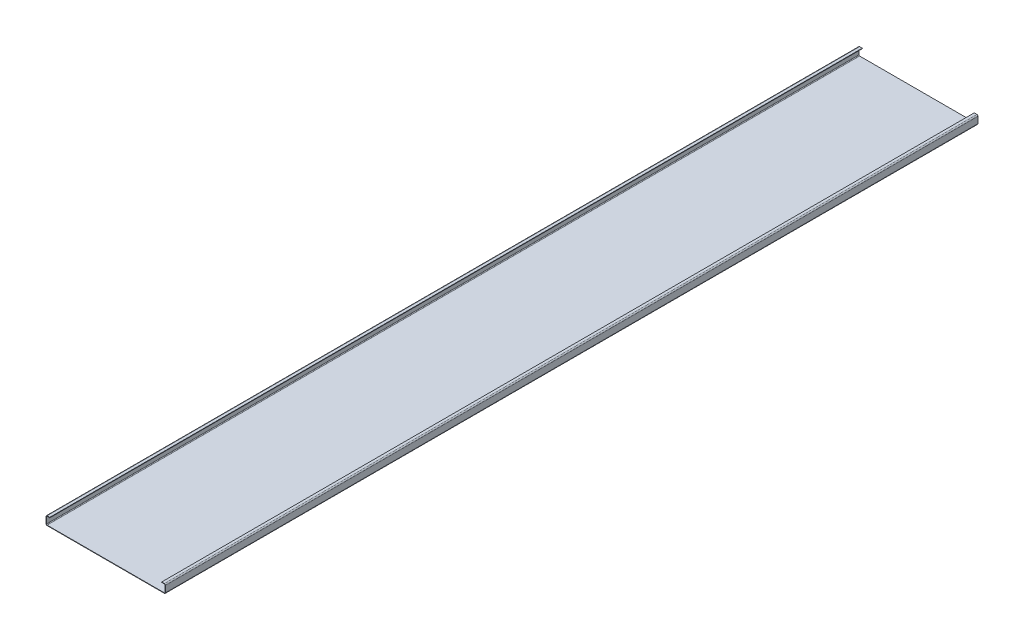
ISO-10303-21;
HEADER;
FILE_DESCRIPTION(('STEP AP214'),'2;1');
FILE_NAME('part.step','',(''),(''),'','','');
FILE_SCHEMA(('AUTOMOTIVE_DESIGN { 1 0 10303 214 1 1 1 1 }'));
ENDSEC;
DATA;
#1=APPLICATION_CONTEXT('core data for automotive mechanical design processes');
#2=APPLICATION_PROTOCOL_DEFINITION('international standard','automotive_design',2000,#1);
#3=PRODUCT_CONTEXT('',#1,'mechanical');
#4=PRODUCT('Part','Part','',(#3));
#5=PRODUCT_RELATED_PRODUCT_CATEGORY('part','',(#4));
#6=PRODUCT_DEFINITION_FORMATION('','',#4);
#7=PRODUCT_DEFINITION_CONTEXT('part definition',#1,'design');
#8=PRODUCT_DEFINITION('design','',#6,#7);
#9=PRODUCT_DEFINITION_SHAPE('','',#8);
#10=(LENGTH_UNIT() NAMED_UNIT(*) SI_UNIT(.MILLI.,.METRE.));
#11=(NAMED_UNIT(*) PLANE_ANGLE_UNIT() SI_UNIT($,.RADIAN.));
#12=(NAMED_UNIT(*) SI_UNIT($,.STERADIAN.) SOLID_ANGLE_UNIT());
#13=UNCERTAINTY_MEASURE_WITH_UNIT(LENGTH_MEASURE(1.E-05),#10,'distance_accuracy_value','');
#14=(GEOMETRIC_REPRESENTATION_CONTEXT(3) GLOBAL_UNCERTAINTY_ASSIGNED_CONTEXT((#13)) GLOBAL_UNIT_ASSIGNED_CONTEXT((#10,
#11,#12)) REPRESENTATION_CONTEXT('',''));
#15=CARTESIAN_POINT('',(0.,0.,0.));
#16=DIRECTION('',(0.,0.,1.));
#17=DIRECTION('',(1.,0.,0.));
#18=AXIS2_PLACEMENT_3D('',#15,#16,#17);
#19=CARTESIAN_POINT('',(3.25,25.,2380.));
#20=DIRECTION('',(0.,0.,1.));
#21=DIRECTION('',(1.,0.,0.));
#22=AXIS2_PLACEMENT_3D('',#19,#20,#21);
#23=PLANE('',#22);
#24=DIRECTION('',(0.,-1.,0.));
#25=VECTOR('',#24,1.);
#26=CARTESIAN_POINT('',(3.25,25.,2380.));
#27=LINE('',#26,#25);
#28=CARTESIAN_POINT('',(3.25,25.,2380.));
#29=VERTEX_POINT('',#28);
#30=CARTESIAN_POINT('',(3.25,23.75,2380.));
#31=VERTEX_POINT('',#30);
#32=EDGE_CURVE('E11',#29,#31,#27,.T.);
#33=ORIENTED_EDGE('',*,*,#32,.F.);
#34=CARTESIAN_POINT('',(3.25,21.75,2380.));
#35=DIRECTION('',(0.,0.,-1.));
#36=DIRECTION('',(-1.,0.,0.));
#37=AXIS2_PLACEMENT_3D('',#34,#35,#36);
#38=CIRCLE('',#37,3.25);
#39=CARTESIAN_POINT('',(0.,21.75,2380.));
#40=VERTEX_POINT('',#39);
#41=EDGE_CURVE('E361',#29,#40,#38,.F.);
#42=ORIENTED_EDGE('',*,*,#41,.T.);
#43=DIRECTION('',(-1.,0.,0.));
#44=VECTOR('',#43,1.);
#45=CARTESIAN_POINT('',(1.25,21.75,2380.));
#46=LINE('',#45,#44);
#47=CARTESIAN_POINT('',(1.25,21.75,2380.));
#48=VERTEX_POINT('',#47);
#49=EDGE_CURVE('E44',#48,#40,#46,.T.);
#50=ORIENTED_EDGE('',*,*,#49,.F.);
#51=CARTESIAN_POINT('',(3.25,21.75,2380.));
#52=DIRECTION('',(0.,0.,1.));
#53=DIRECTION('',(1.,0.,0.));
#54=AXIS2_PLACEMENT_3D('',#51,#52,#53);
#55=CIRCLE('',#54,2.);
#56=EDGE_CURVE('E436',#31,#48,#55,.T.);
#57=ORIENTED_EDGE('',*,*,#56,.F.);
#58=EDGE_LOOP('',(#33,#42,#50,#57));
#59=FACE_BOUND('',#58,.T.);
#60=ADVANCED_FACE('F36',(#59),#23,.T.);
#61=CARTESIAN_POINT('',(1.25,21.75,2380.));
#62=DIRECTION('',(0.,0.,1.));
#63=DIRECTION('',(1.,0.,0.));
#64=AXIS2_PLACEMENT_3D('',#61,#62,#63);
#65=PLANE('',#64);
#66=DIRECTION('',(-1.,0.,0.));
#67=VECTOR('',#66,1.);
#68=CARTESIAN_POINT('',(11.,25.,2380.));
#69=LINE('',#68,#67);
#70=CARTESIAN_POINT('',(11.,25.,2380.));
#71=VERTEX_POINT('',#70);
#72=EDGE_CURVE('E365',#71,#29,#69,.T.);
#73=ORIENTED_EDGE('',*,*,#72,.T.);
#74=ORIENTED_EDGE('',*,*,#32,.T.);
#75=DIRECTION('',(1.,0.,0.));
#76=VECTOR('',#75,1.);
#77=CARTESIAN_POINT('',(11.,23.75,2380.));
#78=LINE('',#77,#76);
#79=CARTESIAN_POINT('',(11.,23.75,2380.));
#80=VERTEX_POINT('',#79);
#81=EDGE_CURVE('E438',#80,#31,#78,.F.);
#82=ORIENTED_EDGE('',*,*,#81,.F.);
#83=DIRECTION('',(0.,-1.,0.));
#84=VECTOR('',#83,1.);
#85=CARTESIAN_POINT('',(11.,25.,2380.));
#86=LINE('',#85,#84);
#87=EDGE_CURVE('E441',#71,#80,#86,.T.);
#88=ORIENTED_EDGE('',*,*,#87,.F.);
#89=EDGE_LOOP('',(#73,#74,#82,#88));
#90=FACE_BOUND('',#89,.T.);
#91=ADVANCED_FACE('F447',(#90),#65,.T.);
#92=CARTESIAN_POINT('',(0.,21.75,0.));
#93=DIRECTION('',(0.,0.,-1.));
#94=DIRECTION('',(-1.,0.,0.));
#95=AXIS2_PLACEMENT_3D('',#92,#93,#94);
#96=PLANE('',#95);
#97=DIRECTION('',(1.,0.,0.));
#98=VECTOR('',#97,1.);
#99=CARTESIAN_POINT('',(0.,21.75,0.));
#100=LINE('',#99,#98);
#101=CARTESIAN_POINT('',(0.,21.75,0.));
#102=VERTEX_POINT('',#101);
#103=CARTESIAN_POINT('',(1.25,21.75,0.));
#104=VERTEX_POINT('',#103);
#105=EDGE_CURVE('E345',#102,#104,#100,.T.);
#106=ORIENTED_EDGE('',*,*,#105,.F.);
#107=CARTESIAN_POINT('',(3.25,21.75,0.));
#108=DIRECTION('',(0.,0.,-1.));
#109=DIRECTION('',(-1.,0.,0.));
#110=AXIS2_PLACEMENT_3D('',#107,#108,#109);
#111=CIRCLE('',#110,3.25);
#112=CARTESIAN_POINT('',(3.25,25.,0.));
#113=VERTEX_POINT('',#112);
#114=EDGE_CURVE('E261',#113,#102,#111,.F.);
#115=ORIENTED_EDGE('',*,*,#114,.F.);
#116=DIRECTION('',(0.,1.,0.));
#117=VECTOR('',#116,1.);
#118=CARTESIAN_POINT('',(3.25,23.75,0.));
#119=LINE('',#118,#117);
#120=CARTESIAN_POINT('',(3.25,23.75,0.));
#121=VERTEX_POINT('',#120);
#122=EDGE_CURVE('E343',#121,#113,#119,.T.);
#123=ORIENTED_EDGE('',*,*,#122,.F.);
#124=CARTESIAN_POINT('',(3.25,21.75,0.));
#125=DIRECTION('',(0.,0.,1.));
#126=DIRECTION('',(1.,0.,0.));
#127=AXIS2_PLACEMENT_3D('',#124,#125,#126);
#128=CIRCLE('',#127,2.);
#129=EDGE_CURVE('E249',#121,#104,#128,.T.);
#130=ORIENTED_EDGE('',*,*,#129,.T.);
#131=EDGE_LOOP('',(#106,#115,#123,#130));
#132=FACE_BOUND('',#131,.T.);
#133=ADVANCED_FACE('F454',(#132),#96,.T.);
#134=CARTESIAN_POINT('',(3.25,23.75,0.));
#135=DIRECTION('',(0.,0.,-1.));
#136=DIRECTION('',(-1.,0.,0.));
#137=AXIS2_PLACEMENT_3D('',#134,#135,#136);
#138=PLANE('',#137);
#139=DIRECTION('',(0.,-1.,0.));
#140=VECTOR('',#139,1.);
#141=CARTESIAN_POINT('',(0.,25.,0.));
#142=LINE('',#141,#140);
#143=CARTESIAN_POINT('',(0.,3.25,0.));
#144=VERTEX_POINT('',#143);
#145=EDGE_CURVE('E264',#102,#144,#142,.T.);
#146=ORIENTED_EDGE('',*,*,#145,.F.);
#147=ORIENTED_EDGE('',*,*,#105,.T.);
#148=DIRECTION('',(0.,1.,0.));
#149=VECTOR('',#148,1.);
#150=CARTESIAN_POINT('',(1.25,25.,0.));
#151=LINE('',#150,#149);
#152=CARTESIAN_POINT('',(1.25,3.25,0.));
#153=VERTEX_POINT('',#152);
#154=EDGE_CURVE('E246',#104,#153,#151,.F.);
#155=ORIENTED_EDGE('',*,*,#154,.T.);
#156=DIRECTION('',(-1.,0.,0.));
#157=VECTOR('',#156,1.);
#158=CARTESIAN_POINT('',(1.25,3.25,0.));
#159=LINE('',#158,#157);
#160=EDGE_CURVE('E335',#153,#144,#159,.T.);
#161=ORIENTED_EDGE('',*,*,#160,.T.);
#162=EDGE_LOOP('',(#146,#147,#155,#161));
#163=FACE_BOUND('',#162,.T.);
#164=ADVANCED_FACE('F457',(#163),#138,.T.);
#165=CARTESIAN_POINT('',(0.,3.25,2380.));
#166=DIRECTION('',(0.,0.,1.));
#167=DIRECTION('',(1.,0.,0.));
#168=AXIS2_PLACEMENT_3D('',#165,#166,#167);
#169=PLANE('',#168);
#170=DIRECTION('',(1.,0.,0.));
#171=VECTOR('',#170,1.);
#172=CARTESIAN_POINT('',(0.,3.25,2380.));
#173=LINE('',#172,#171);
#174=CARTESIAN_POINT('',(0.,3.25,2380.));
#175=VERTEX_POINT('',#174);
#176=CARTESIAN_POINT('',(1.25,3.25,2380.));
#177=VERTEX_POINT('',#176);
#178=EDGE_CURVE('E341',#175,#177,#173,.T.);
#179=ORIENTED_EDGE('',*,*,#178,.F.);
#180=CARTESIAN_POINT('',(3.25,3.25,2380.));
#181=DIRECTION('',(0.,0.,-1.));
#182=DIRECTION('',(-1.,0.,0.));
#183=AXIS2_PLACEMENT_3D('',#180,#181,#182);
#184=CIRCLE('',#183,3.25);
#185=CARTESIAN_POINT('',(3.25,0.,2380.));
#186=VERTEX_POINT('',#185);
#187=EDGE_CURVE('E373',#175,#186,#184,.F.);
#188=ORIENTED_EDGE('',*,*,#187,.T.);
#189=DIRECTION('',(0.,-1.,0.));
#190=VECTOR('',#189,1.);
#191=CARTESIAN_POINT('',(3.25,1.25,2380.));
#192=LINE('',#191,#190);
#193=CARTESIAN_POINT('',(3.25,1.25,2380.));
#194=VERTEX_POINT('',#193);
#195=EDGE_CURVE('E339',#194,#186,#192,.T.);
#196=ORIENTED_EDGE('',*,*,#195,.F.);
#197=CARTESIAN_POINT('',(3.25,3.25,2380.));
#198=DIRECTION('',(0.,0.,1.));
#199=DIRECTION('',(1.,0.,0.));
#200=AXIS2_PLACEMENT_3D('',#197,#198,#199);
#201=CIRCLE('',#200,2.);
#202=EDGE_CURVE('E432',#177,#194,#201,.T.);
#203=ORIENTED_EDGE('',*,*,#202,.F.);
#204=EDGE_LOOP('',(#179,#188,#196,#203));
#205=FACE_BOUND('',#204,.T.);
#206=ADVANCED_FACE('F477',(#205),#169,.T.);
#207=CARTESIAN_POINT('',(3.25,1.25,2380.));
#208=DIRECTION('',(0.,0.,1.));
#209=DIRECTION('',(1.,0.,0.));
#210=AXIS2_PLACEMENT_3D('',#207,#208,#209);
#211=PLANE('',#210);
#212=DIRECTION('',(0.,-1.,0.));
#213=VECTOR('',#212,1.);
#214=CARTESIAN_POINT('',(0.,25.,2380.));
#215=LINE('',#214,#213);
#216=EDGE_CURVE('E352',#40,#175,#215,.T.);
#217=ORIENTED_EDGE('',*,*,#216,.T.);
#218=ORIENTED_EDGE('',*,*,#178,.T.);
#219=DIRECTION('',(0.,1.,0.));
#220=VECTOR('',#219,1.);
#221=CARTESIAN_POINT('',(1.25,25.,2380.));
#222=LINE('',#221,#220);
#223=EDGE_CURVE('E355',#48,#177,#222,.F.);
#224=ORIENTED_EDGE('',*,*,#223,.F.);
#225=ORIENTED_EDGE('',*,*,#49,.T.);
#226=EDGE_LOOP('',(#217,#218,#224,#225));
#227=FACE_BOUND('',#226,.T.);
#228=ADVANCED_FACE('F350',(#227),#211,.T.);
#229=CARTESIAN_POINT('',(3.25,0.,0.));
#230=DIRECTION('',(0.,0.,-1.));
#231=DIRECTION('',(-1.,0.,0.));
#232=AXIS2_PLACEMENT_3D('',#229,#230,#231);
#233=PLANE('',#232);
#234=DIRECTION('',(0.,1.,0.));
#235=VECTOR('',#234,1.);
#236=CARTESIAN_POINT('',(3.25,0.,0.));
#237=LINE('',#236,#235);
#238=CARTESIAN_POINT('',(3.25,0.,0.));
#239=VERTEX_POINT('',#238);
#240=CARTESIAN_POINT('',(3.25,1.25,0.));
#241=VERTEX_POINT('',#240);
#242=EDGE_CURVE('E337',#239,#241,#237,.T.);
#243=ORIENTED_EDGE('',*,*,#242,.F.);
#244=CARTESIAN_POINT('',(3.25,3.25,0.));
#245=DIRECTION('',(0.,0.,-1.));
#246=DIRECTION('',(-1.,0.,0.));
#247=AXIS2_PLACEMENT_3D('',#244,#245,#246);
#248=CIRCLE('',#247,3.25);
#249=EDGE_CURVE('E267',#144,#239,#248,.F.);
#250=ORIENTED_EDGE('',*,*,#249,.F.);
#251=ORIENTED_EDGE('',*,*,#160,.F.);
#252=CARTESIAN_POINT('',(3.25,3.25,0.));
#253=DIRECTION('',(0.,0.,1.));
#254=DIRECTION('',(1.,0.,0.));
#255=AXIS2_PLACEMENT_3D('',#252,#253,#254);
#256=CIRCLE('',#255,2.);
#257=EDGE_CURVE('E243',#153,#241,#256,.T.);
#258=ORIENTED_EDGE('',*,*,#257,.T.);
#259=EDGE_LOOP('',(#243,#250,#251,#258));
#260=FACE_BOUND('',#259,.T.);
#261=ADVANCED_FACE('F471',(#260),#233,.T.);
#262=CARTESIAN_POINT('',(1.25,3.25,0.));
#263=DIRECTION('',(0.,0.,-1.));
#264=DIRECTION('',(-1.,0.,0.));
#265=AXIS2_PLACEMENT_3D('',#262,#263,#264);
#266=PLANE('',#265);
#267=DIRECTION('',(1.,0.,0.));
#268=VECTOR('',#267,1.);
#269=CARTESIAN_POINT('',(0.,0.,0.));
#270=LINE('',#269,#268);
#271=CARTESIAN_POINT('',(346.75,0.,0.));
#272=VERTEX_POINT('',#271);
#273=EDGE_CURVE('E270',#239,#272,#270,.T.);
#274=ORIENTED_EDGE('',*,*,#273,.F.);
#275=ORIENTED_EDGE('',*,*,#242,.T.);
#276=DIRECTION('',(1.,0.,0.));
#277=VECTOR('',#276,1.);
#278=CARTESIAN_POINT('',(0.,1.25,0.));
#279=LINE('',#278,#277);
#280=CARTESIAN_POINT('',(346.75,1.25,0.));
#281=VERTEX_POINT('',#280);
#282=EDGE_CURVE('E240',#241,#281,#279,.T.);
#283=ORIENTED_EDGE('',*,*,#282,.T.);
#284=DIRECTION('',(0.,-1.,0.));
#285=VECTOR('',#284,1.);
#286=CARTESIAN_POINT('',(346.75,1.25,0.));
#287=LINE('',#286,#285);
#288=EDGE_CURVE('E331',#281,#272,#287,.T.);
#289=ORIENTED_EDGE('',*,*,#288,.T.);
#290=EDGE_LOOP('',(#274,#275,#283,#289));
#291=FACE_BOUND('',#290,.T.);
#292=ADVANCED_FACE('F481',(#291),#266,.T.);
#293=CARTESIAN_POINT('',(346.75,0.,2380.));
#294=DIRECTION('',(0.,0.,1.));
#295=DIRECTION('',(1.,0.,0.));
#296=AXIS2_PLACEMENT_3D('',#293,#294,#295);
#297=PLANE('',#296);
#298=DIRECTION('',(0.,1.,0.));
#299=VECTOR('',#298,1.);
#300=CARTESIAN_POINT('',(346.75,0.,2380.));
#301=LINE('',#300,#299);
#302=CARTESIAN_POINT('',(346.75,0.,2380.));
#303=VERTEX_POINT('',#302);
#304=CARTESIAN_POINT('',(346.75,1.25,2380.));
#305=VERTEX_POINT('',#304);
#306=EDGE_CURVE('E193',#303,#305,#301,.T.);
#307=ORIENTED_EDGE('',*,*,#306,.F.);
#308=CARTESIAN_POINT('',(346.75,3.25,2380.));
#309=DIRECTION('',(0.,0.,-1.));
#310=DIRECTION('',(-1.,0.,0.));
#311=AXIS2_PLACEMENT_3D('',#308,#309,#310);
#312=CIRCLE('',#311,3.25);
#313=CARTESIAN_POINT('',(350.,3.25,2380.));
#314=VERTEX_POINT('',#313);
#315=EDGE_CURVE('E197',#303,#314,#312,.F.);
#316=ORIENTED_EDGE('',*,*,#315,.T.);
#317=DIRECTION('',(1.,0.,0.));
#318=VECTOR('',#317,1.);
#319=CARTESIAN_POINT('',(348.75,3.25,2380.));
#320=LINE('',#319,#318);
#321=CARTESIAN_POINT('',(348.75,3.25,2380.));
#322=VERTEX_POINT('',#321);
#323=EDGE_CURVE('E181',#322,#314,#320,.T.);
#324=ORIENTED_EDGE('',*,*,#323,.F.);
#325=CARTESIAN_POINT('',(346.75,3.25,2380.));
#326=DIRECTION('',(0.,0.,1.));
#327=DIRECTION('',(1.,0.,0.));
#328=AXIS2_PLACEMENT_3D('',#325,#326,#327);
#329=CIRCLE('',#328,2.);
#330=EDGE_CURVE('E394',#305,#322,#329,.T.);
#331=ORIENTED_EDGE('',*,*,#330,.F.);
#332=EDGE_LOOP('',(#307,#316,#324,#331));
#333=FACE_BOUND('',#332,.T.);
#334=ADVANCED_FACE('F199',(#333),#297,.T.);
#335=CARTESIAN_POINT('',(348.75,3.25,2380.));
#336=DIRECTION('',(0.,0.,1.));
#337=DIRECTION('',(1.,0.,0.));
#338=AXIS2_PLACEMENT_3D('',#335,#336,#337);
#339=PLANE('',#338);
#340=DIRECTION('',(1.,0.,0.));
#341=VECTOR('',#340,1.);
#342=CARTESIAN_POINT('',(0.,0.,2380.));
#343=LINE('',#342,#341);
#344=EDGE_CURVE('E203',#186,#303,#343,.T.);
#345=ORIENTED_EDGE('',*,*,#344,.T.);
#346=ORIENTED_EDGE('',*,*,#306,.T.);
#347=DIRECTION('',(1.,0.,0.));
#348=VECTOR('',#347,1.);
#349=CARTESIAN_POINT('',(0.,1.25,2380.));
#350=LINE('',#349,#348);
#351=EDGE_CURVE('E429',#194,#305,#350,.T.);
#352=ORIENTED_EDGE('',*,*,#351,.F.);
#353=ORIENTED_EDGE('',*,*,#195,.T.);
#354=EDGE_LOOP('',(#345,#346,#352,#353));
#355=FACE_BOUND('',#354,.T.);
#356=ADVANCED_FACE('F381',(#355),#339,.T.);
#357=CARTESIAN_POINT('',(350.,3.25,0.));
#358=DIRECTION('',(0.,0.,-1.));
#359=DIRECTION('',(-1.,0.,0.));
#360=AXIS2_PLACEMENT_3D('',#357,#358,#359);
#361=PLANE('',#360);
#362=DIRECTION('',(-1.,0.,0.));
#363=VECTOR('',#362,1.);
#364=CARTESIAN_POINT('',(350.,3.25,0.));
#365=LINE('',#364,#363);
#366=CARTESIAN_POINT('',(350.,3.25,0.));
#367=VERTEX_POINT('',#366);
#368=CARTESIAN_POINT('',(348.75,3.25,0.));
#369=VERTEX_POINT('',#368);
#370=EDGE_CURVE('E194',#367,#369,#365,.T.);
#371=ORIENTED_EDGE('',*,*,#370,.F.);
#372=CARTESIAN_POINT('',(346.75,3.25,0.));
#373=DIRECTION('',(0.,0.,-1.));
#374=DIRECTION('',(-1.,0.,0.));
#375=AXIS2_PLACEMENT_3D('',#372,#373,#374);
#376=CIRCLE('',#375,3.25);
#377=EDGE_CURVE('E210',#272,#367,#376,.F.);
#378=ORIENTED_EDGE('',*,*,#377,.F.);
#379=ORIENTED_EDGE('',*,*,#288,.F.);
#380=CARTESIAN_POINT('',(346.75,3.25,0.));
#381=DIRECTION('',(0.,0.,1.));
#382=DIRECTION('',(1.,0.,0.));
#383=AXIS2_PLACEMENT_3D('',#380,#381,#382);
#384=CIRCLE('',#383,2.);
#385=EDGE_CURVE('E237',#281,#369,#384,.T.);
#386=ORIENTED_EDGE('',*,*,#385,.T.);
#387=EDGE_LOOP('',(#371,#378,#379,#386));
#388=FACE_BOUND('',#387,.T.);
#389=ADVANCED_FACE('F388',(#388),#361,.T.);
#390=CARTESIAN_POINT('',(346.75,1.25,0.));
#391=DIRECTION('',(0.,0.,-1.));
#392=DIRECTION('',(-1.,0.,0.));
#393=AXIS2_PLACEMENT_3D('',#390,#391,#392);
#394=PLANE('',#393);
#395=DIRECTION('',(0.,1.,0.));
#396=VECTOR('',#395,1.);
#397=CARTESIAN_POINT('',(350.,0.,0.));
#398=LINE('',#397,#396);
#399=CARTESIAN_POINT('',(350.,21.75,0.));
#400=VERTEX_POINT('',#399);
#401=EDGE_CURVE('E274',#367,#400,#398,.T.);
#402=ORIENTED_EDGE('',*,*,#401,.F.);
#403=ORIENTED_EDGE('',*,*,#370,.T.);
#404=DIRECTION('',(0.,1.,0.));
#405=VECTOR('',#404,1.);
#406=CARTESIAN_POINT('',(348.75,0.,0.));
#407=LINE('',#406,#405);
#408=CARTESIAN_POINT('',(348.75,21.75,0.));
#409=VERTEX_POINT('',#408);
#410=EDGE_CURVE('E235',#369,#409,#407,.T.);
#411=ORIENTED_EDGE('',*,*,#410,.T.);
#412=DIRECTION('',(1.,0.,0.));
#413=VECTOR('',#412,1.);
#414=CARTESIAN_POINT('',(348.75,21.75,0.));
#415=LINE('',#414,#413);
#416=EDGE_CURVE('E117',#409,#400,#415,.T.);
#417=ORIENTED_EDGE('',*,*,#416,.T.);
#418=EDGE_LOOP('',(#402,#403,#411,#417));
#419=FACE_BOUND('',#418,.T.);
#420=ADVANCED_FACE('F390',(#419),#394,.T.);
#421=CARTESIAN_POINT('',(350.,21.75,2380.));
#422=DIRECTION('',(0.,0.,1.));
#423=DIRECTION('',(1.,0.,0.));
#424=AXIS2_PLACEMENT_3D('',#421,#422,#423);
#425=PLANE('',#424);
#426=DIRECTION('',(-1.,0.,0.));
#427=VECTOR('',#426,1.);
#428=CARTESIAN_POINT('',(350.,21.75,2380.));
#429=LINE('',#428,#427);
#430=CARTESIAN_POINT('',(350.,21.75,2380.));
#431=VERTEX_POINT('',#430);
#432=CARTESIAN_POINT('',(348.75,21.75,2380.));
#433=VERTEX_POINT('',#432);
#434=EDGE_CURVE('E329',#431,#433,#429,.T.);
#435=ORIENTED_EDGE('',*,*,#434,.F.);
#436=CARTESIAN_POINT('',(346.75,21.75,2380.));
#437=DIRECTION('',(0.,0.,-1.));
#438=DIRECTION('',(-1.,0.,0.));
#439=AXIS2_PLACEMENT_3D('',#436,#437,#438);
#440=CIRCLE('',#439,3.25);
#441=CARTESIAN_POINT('',(346.75,25.,2380.));
#442=VERTEX_POINT('',#441);
#443=EDGE_CURVE('E218',#431,#442,#440,.F.);
#444=ORIENTED_EDGE('',*,*,#443,.T.);
#445=DIRECTION('',(0.,1.,0.));
#446=VECTOR('',#445,1.);
#447=CARTESIAN_POINT('',(346.75,23.75,2380.));
#448=LINE('',#447,#446);
#449=CARTESIAN_POINT('',(346.75,23.75,2380.));
#450=VERTEX_POINT('',#449);
#451=EDGE_CURVE('E52',#450,#442,#448,.T.);
#452=ORIENTED_EDGE('',*,*,#451,.F.);
#453=CARTESIAN_POINT('',(346.75,21.75,2380.));
#454=DIRECTION('',(0.,0.,1.));
#455=DIRECTION('',(1.,0.,0.));
#456=AXIS2_PLACEMENT_3D('',#453,#454,#455);
#457=CIRCLE('',#456,2.);
#458=EDGE_CURVE('E422',#433,#450,#457,.T.);
#459=ORIENTED_EDGE('',*,*,#458,.F.);
#460=EDGE_LOOP('',(#435,#444,#452,#459));
#461=FACE_BOUND('',#460,.T.);
#462=ADVANCED_FACE('F552',(#461),#425,.T.);
#463=CARTESIAN_POINT('',(346.75,23.75,2380.));
#464=DIRECTION('',(0.,0.,1.));
#465=DIRECTION('',(1.,0.,0.));
#466=AXIS2_PLACEMENT_3D('',#463,#464,#465);
#467=PLANE('',#466);
#468=DIRECTION('',(0.,1.,0.));
#469=VECTOR('',#468,1.);
#470=CARTESIAN_POINT('',(350.,0.,2380.));
#471=LINE('',#470,#469);
#472=EDGE_CURVE('E185',#314,#431,#471,.T.);
#473=ORIENTED_EDGE('',*,*,#472,.T.);
#474=ORIENTED_EDGE('',*,*,#434,.T.);
#475=DIRECTION('',(0.,1.,0.));
#476=VECTOR('',#475,1.);
#477=CARTESIAN_POINT('',(348.75,0.,2380.));
#478=LINE('',#477,#476);
#479=EDGE_CURVE('E188',#322,#433,#478,.T.);
#480=ORIENTED_EDGE('',*,*,#479,.F.);
#481=ORIENTED_EDGE('',*,*,#323,.T.);
#482=EDGE_LOOP('',(#473,#474,#480,#481));
#483=FACE_BOUND('',#482,.T.);
#484=ADVANCED_FACE('F183',(#483),#467,.T.);
#485=CARTESIAN_POINT('',(346.75,25.,0.));
#486=DIRECTION('',(0.,0.,-1.));
#487=DIRECTION('',(-1.,0.,0.));
#488=AXIS2_PLACEMENT_3D('',#485,#486,#487);
#489=PLANE('',#488);
#490=DIRECTION('',(0.,-1.,0.));
#491=VECTOR('',#490,1.);
#492=CARTESIAN_POINT('',(346.75,25.,0.));
#493=LINE('',#492,#491);
#494=CARTESIAN_POINT('',(346.75,25.,0.));
#495=VERTEX_POINT('',#494);
#496=CARTESIAN_POINT('',(346.75,23.75,0.));
#497=VERTEX_POINT('',#496);
#498=EDGE_CURVE('E124',#495,#497,#493,.T.);
#499=ORIENTED_EDGE('',*,*,#498,.F.);
#500=CARTESIAN_POINT('',(346.75,21.75,0.));
#501=DIRECTION('',(0.,0.,-1.));
#502=DIRECTION('',(-1.,0.,0.));
#503=AXIS2_PLACEMENT_3D('',#500,#501,#502);
#504=CIRCLE('',#503,3.25);
#505=EDGE_CURVE('E276',#400,#495,#504,.F.);
#506=ORIENTED_EDGE('',*,*,#505,.F.);
#507=ORIENTED_EDGE('',*,*,#416,.F.);
#508=CARTESIAN_POINT('',(346.75,21.75,0.));
#509=DIRECTION('',(0.,0.,1.));
#510=DIRECTION('',(1.,0.,0.));
#511=AXIS2_PLACEMENT_3D('',#508,#509,#510);
#512=CIRCLE('',#511,2.);
#513=EDGE_CURVE('E233',#409,#497,#512,.T.);
#514=ORIENTED_EDGE('',*,*,#513,.T.);
#515=EDGE_LOOP('',(#499,#506,#507,#514));
#516=FACE_BOUND('',#515,.T.);
#517=ADVANCED_FACE('F405',(#516),#489,.T.);
#518=CARTESIAN_POINT('',(348.75,21.75,0.));
#519=DIRECTION('',(0.,0.,-1.));
#520=DIRECTION('',(-1.,0.,0.));
#521=AXIS2_PLACEMENT_3D('',#518,#519,#520);
#522=PLANE('',#521);
#523=DIRECTION('',(-1.,0.,0.));
#524=VECTOR('',#523,1.);
#525=CARTESIAN_POINT('',(350.,25.,0.));
#526=LINE('',#525,#524);
#527=CARTESIAN_POINT('',(339.,25.,0.));
#528=VERTEX_POINT('',#527);
#529=EDGE_CURVE('E224',#495,#528,#526,.T.);
#530=ORIENTED_EDGE('',*,*,#529,.F.);
#531=ORIENTED_EDGE('',*,*,#498,.T.);
#532=DIRECTION('',(-1.,0.,0.));
#533=VECTOR('',#532,1.);
#534=CARTESIAN_POINT('',(350.,23.75,0.));
#535=LINE('',#534,#533);
#536=CARTESIAN_POINT('',(339.,23.75,0.));
#537=VERTEX_POINT('',#536);
#538=EDGE_CURVE('E230',#497,#537,#535,.T.);
#539=ORIENTED_EDGE('',*,*,#538,.T.);
#540=DIRECTION('',(0.,1.,0.));
#541=VECTOR('',#540,1.);
#542=CARTESIAN_POINT('',(339.,23.75,0.));
#543=LINE('',#542,#541);
#544=EDGE_CURVE('E227',#537,#528,#543,.T.);
#545=ORIENTED_EDGE('',*,*,#544,.T.);
#546=EDGE_LOOP('',(#530,#531,#539,#545));
#547=FACE_BOUND('',#546,.T.);
#548=ADVANCED_FACE('F413',(#547),#522,.T.);
#549=CARTESIAN_POINT('',(350.,25.,2380.));
#550=DIRECTION('',(0.,-1.,0.));
#551=DIRECTION('',(1.,0.,0.));
#552=AXIS2_PLACEMENT_3D('',#549,#550,#551);
#553=PLANE('',#552);
#554=ORIENTED_EDGE('',*,*,#529,.T.);
#555=DIRECTION('',(0.,0.,-1.));
#556=VECTOR('',#555,1.);
#557=CARTESIAN_POINT('',(339.,25.,2380.));
#558=LINE('',#557,#556);
#559=CARTESIAN_POINT('',(339.,25.,2380.));
#560=VERTEX_POINT('',#559);
#561=EDGE_CURVE('E324',#560,#528,#558,.T.);
#562=ORIENTED_EDGE('',*,*,#561,.F.);
#563=DIRECTION('',(-1.,0.,0.));
#564=VECTOR('',#563,1.);
#565=CARTESIAN_POINT('',(350.,25.,2380.));
#566=LINE('',#565,#564);
#567=EDGE_CURVE('E130',#442,#560,#566,.T.);
#568=ORIENTED_EDGE('',*,*,#567,.F.);
#569=DIRECTION('',(0.,0.,-1.));
#570=VECTOR('',#569,1.);
#571=CARTESIAN_POINT('',(346.75,25.,2380.));
#572=LINE('',#571,#570);
#573=EDGE_CURVE('E220',#442,#495,#572,.T.);
#574=ORIENTED_EDGE('',*,*,#573,.T.);
#575=EDGE_LOOP('',(#554,#562,#568,#574));
#576=FACE_BOUND('',#575,.T.);
#577=ADVANCED_FACE('F411',(#576),#553,.F.);
#578=CARTESIAN_POINT('',(339.,23.75,2380.));
#579=DIRECTION('',(-1.,0.,0.));
#580=DIRECTION('',(0.,0.,1.));
#581=AXIS2_PLACEMENT_3D('',#578,#579,#580);
#582=PLANE('',#581);
#583=ORIENTED_EDGE('',*,*,#544,.F.);
#584=DIRECTION('',(0.,0.,-1.));
#585=VECTOR('',#584,1.);
#586=CARTESIAN_POINT('',(339.,23.75,2380.));
#587=LINE('',#586,#585);
#588=CARTESIAN_POINT('',(339.,23.75,2380.));
#589=VERTEX_POINT('',#588);
#590=EDGE_CURVE('E322',#589,#537,#587,.T.);
#591=ORIENTED_EDGE('',*,*,#590,.F.);
#592=DIRECTION('',(0.,1.,0.));
#593=VECTOR('',#592,1.);
#594=CARTESIAN_POINT('',(339.,23.75,2380.));
#595=LINE('',#594,#593);
#596=EDGE_CURVE('E418',#589,#560,#595,.T.);
#597=ORIENTED_EDGE('',*,*,#596,.T.);
#598=ORIENTED_EDGE('',*,*,#561,.T.);
#599=EDGE_LOOP('',(#583,#591,#597,#598));
#600=FACE_BOUND('',#599,.T.);
#601=ADVANCED_FACE('F416',(#600),#582,.T.);
#602=CARTESIAN_POINT('',(350.,23.75,2380.));
#603=DIRECTION('',(0.,-1.,0.));
#604=DIRECTION('',(1.,0.,0.));
#605=AXIS2_PLACEMENT_3D('',#602,#603,#604);
#606=PLANE('',#605);
#607=ORIENTED_EDGE('',*,*,#538,.F.);
#608=DIRECTION('',(0.,0.,-1.));
#609=VECTOR('',#608,1.);
#610=CARTESIAN_POINT('',(346.75,23.75,2380.));
#611=LINE('',#610,#609);
#612=EDGE_CURVE('E319',#450,#497,#611,.T.);
#613=ORIENTED_EDGE('',*,*,#612,.F.);
#614=DIRECTION('',(-1.,0.,0.));
#615=VECTOR('',#614,1.);
#616=CARTESIAN_POINT('',(350.,23.75,2380.));
#617=LINE('',#616,#615);
#618=EDGE_CURVE('E420',#450,#589,#617,.T.);
#619=ORIENTED_EDGE('',*,*,#618,.T.);
#620=ORIENTED_EDGE('',*,*,#590,.T.);
#621=EDGE_LOOP('',(#607,#613,#619,#620));
#622=FACE_BOUND('',#621,.T.);
#623=ADVANCED_FACE('F608',(#622),#606,.T.);
#624=CARTESIAN_POINT('',(346.75,21.75,2380.));
#625=DIRECTION('',(0.,0.,-1.));
#626=DIRECTION('',(-1.,0.,0.));
#627=AXIS2_PLACEMENT_3D('',#624,#625,#626);
#628=CYLINDRICAL_SURFACE('',#627,2.);
#629=ORIENTED_EDGE('',*,*,#513,.F.);
#630=DIRECTION('',(0.,0.,-1.));
#631=VECTOR('',#630,1.);
#632=CARTESIAN_POINT('',(348.75,21.75,2380.));
#633=LINE('',#632,#631);
#634=EDGE_CURVE('E316',#433,#409,#633,.T.);
#635=ORIENTED_EDGE('',*,*,#634,.F.);
#636=ORIENTED_EDGE('',*,*,#458,.T.);
#637=ORIENTED_EDGE('',*,*,#612,.T.);
#638=EDGE_LOOP('',(#629,#635,#636,#637));
#639=FACE_BOUND('',#638,.T.);
#640=ADVANCED_FACE('F402',(#639),#628,.F.);
#641=CARTESIAN_POINT('',(348.75,0.,2380.));
#642=DIRECTION('',(-1.,0.,0.));
#643=DIRECTION('',(0.,0.,1.));
#644=AXIS2_PLACEMENT_3D('',#641,#642,#643);
#645=PLANE('',#644);
#646=ORIENTED_EDGE('',*,*,#410,.F.);
#647=DIRECTION('',(0.,0.,-1.));
#648=VECTOR('',#647,1.);
#649=CARTESIAN_POINT('',(348.75,3.25,2380.));
#650=LINE('',#649,#648);
#651=EDGE_CURVE('E313',#322,#369,#650,.T.);
#652=ORIENTED_EDGE('',*,*,#651,.F.);
#653=ORIENTED_EDGE('',*,*,#479,.T.);
#654=ORIENTED_EDGE('',*,*,#634,.T.);
#655=EDGE_LOOP('',(#646,#652,#653,#654));
#656=FACE_BOUND('',#655,.T.);
#657=ADVANCED_FACE('F396',(#656),#645,.T.);
#658=CARTESIAN_POINT('',(346.75,3.25,2380.));
#659=DIRECTION('',(0.,0.,-1.));
#660=DIRECTION('',(-1.,0.,0.));
#661=AXIS2_PLACEMENT_3D('',#658,#659,#660);
#662=CYLINDRICAL_SURFACE('',#661,2.);
#663=ORIENTED_EDGE('',*,*,#385,.F.);
#664=DIRECTION('',(0.,0.,-1.));
#665=VECTOR('',#664,1.);
#666=CARTESIAN_POINT('',(346.75,1.25,2380.));
#667=LINE('',#666,#665);
#668=EDGE_CURVE('E310',#305,#281,#667,.T.);
#669=ORIENTED_EDGE('',*,*,#668,.F.);
#670=ORIENTED_EDGE('',*,*,#330,.T.);
#671=ORIENTED_EDGE('',*,*,#651,.T.);
#672=EDGE_LOOP('',(#663,#669,#670,#671));
#673=FACE_BOUND('',#672,.T.);
#674=ADVANCED_FACE('F393',(#673),#662,.F.);
#675=CARTESIAN_POINT('',(0.,1.25,2380.));
#676=DIRECTION('',(0.,1.,0.));
#677=DIRECTION('',(0.,0.,1.));
#678=AXIS2_PLACEMENT_3D('',#675,#676,#677);
#679=PLANE('',#678);
#680=ORIENTED_EDGE('',*,*,#282,.F.);
#681=DIRECTION('',(0.,0.,-1.));
#682=VECTOR('',#681,1.);
#683=CARTESIAN_POINT('',(3.25,1.25,2380.));
#684=LINE('',#683,#682);
#685=EDGE_CURVE('E307',#194,#241,#684,.T.);
#686=ORIENTED_EDGE('',*,*,#685,.F.);
#687=ORIENTED_EDGE('',*,*,#351,.T.);
#688=ORIENTED_EDGE('',*,*,#668,.T.);
#689=EDGE_LOOP('',(#680,#686,#687,#688));
#690=FACE_BOUND('',#689,.T.);
#691=ADVANCED_FACE('F479',(#690),#679,.T.);
#692=CARTESIAN_POINT('',(3.25,3.25,2380.));
#693=DIRECTION('',(0.,0.,-1.));
#694=DIRECTION('',(-1.,0.,0.));
#695=AXIS2_PLACEMENT_3D('',#692,#693,#694);
#696=CYLINDRICAL_SURFACE('',#695,2.);
#697=ORIENTED_EDGE('',*,*,#257,.F.);
#698=DIRECTION('',(0.,0.,-1.));
#699=VECTOR('',#698,1.);
#700=CARTESIAN_POINT('',(1.25,3.25,2380.));
#701=LINE('',#700,#699);
#702=EDGE_CURVE('E304',#177,#153,#701,.T.);
#703=ORIENTED_EDGE('',*,*,#702,.F.);
#704=ORIENTED_EDGE('',*,*,#202,.T.);
#705=ORIENTED_EDGE('',*,*,#685,.T.);
#706=EDGE_LOOP('',(#697,#703,#704,#705));
#707=FACE_BOUND('',#706,.T.);
#708=ADVANCED_FACE('F467',(#707),#696,.F.);
#709=CARTESIAN_POINT('',(1.25,25.,2380.));
#710=DIRECTION('',(1.,0.,0.));
#711=DIRECTION('',(0.,0.,-1.));
#712=AXIS2_PLACEMENT_3D('',#709,#710,#711);
#713=PLANE('',#712);
#714=ORIENTED_EDGE('',*,*,#154,.F.);
#715=DIRECTION('',(0.,0.,-1.));
#716=VECTOR('',#715,1.);
#717=CARTESIAN_POINT('',(1.25,21.75,2380.));
#718=LINE('',#717,#716);
#719=EDGE_CURVE('E301',#48,#104,#718,.T.);
#720=ORIENTED_EDGE('',*,*,#719,.F.);
#721=ORIENTED_EDGE('',*,*,#223,.T.);
#722=ORIENTED_EDGE('',*,*,#702,.T.);
#723=EDGE_LOOP('',(#714,#720,#721,#722));
#724=FACE_BOUND('',#723,.T.);
#725=ADVANCED_FACE('F462',(#724),#713,.T.);
#726=CARTESIAN_POINT('',(3.25,21.75,2380.));
#727=DIRECTION('',(0.,0.,-1.));
#728=DIRECTION('',(-1.,0.,0.));
#729=AXIS2_PLACEMENT_3D('',#726,#727,#728);
#730=CYLINDRICAL_SURFACE('',#729,2.);
#731=ORIENTED_EDGE('',*,*,#129,.F.);
#732=DIRECTION('',(0.,0.,-1.));
#733=VECTOR('',#732,1.);
#734=CARTESIAN_POINT('',(3.25,23.75,2380.));
#735=LINE('',#734,#733);
#736=EDGE_CURVE('E298',#31,#121,#735,.T.);
#737=ORIENTED_EDGE('',*,*,#736,.F.);
#738=ORIENTED_EDGE('',*,*,#56,.T.);
#739=ORIENTED_EDGE('',*,*,#719,.T.);
#740=EDGE_LOOP('',(#731,#737,#738,#739));
#741=FACE_BOUND('',#740,.T.);
#742=ADVANCED_FACE('F460',(#741),#730,.F.);
#743=CARTESIAN_POINT('',(11.,23.75,2380.));
#744=DIRECTION('',(0.,-1.,0.));
#745=DIRECTION('',(0.,0.,-1.));
#746=AXIS2_PLACEMENT_3D('',#743,#744,#745);
#747=PLANE('',#746);
#748=DIRECTION('',(1.,0.,0.));
#749=VECTOR('',#748,1.);
#750=CARTESIAN_POINT('',(11.,23.75,0.));
#751=LINE('',#750,#749);
#752=CARTESIAN_POINT('',(11.,23.75,0.));
#753=VERTEX_POINT('',#752);
#754=EDGE_CURVE('E252',#753,#121,#751,.F.);
#755=ORIENTED_EDGE('',*,*,#754,.F.);
#756=DIRECTION('',(0.,0.,-1.));
#757=VECTOR('',#756,1.);
#758=CARTESIAN_POINT('',(11.,23.75,2380.));
#759=LINE('',#758,#757);
#760=EDGE_CURVE('E296',#80,#753,#759,.T.);
#761=ORIENTED_EDGE('',*,*,#760,.F.);
#762=ORIENTED_EDGE('',*,*,#81,.T.);
#763=ORIENTED_EDGE('',*,*,#736,.T.);
#764=EDGE_LOOP('',(#755,#761,#762,#763));
#765=FACE_BOUND('',#764,.T.);
#766=ADVANCED_FACE('F682',(#765),#747,.T.);
#767=CARTESIAN_POINT('',(11.,25.,2380.));
#768=DIRECTION('',(1.,0.,0.));
#769=DIRECTION('',(0.,0.,-1.));
#770=AXIS2_PLACEMENT_3D('',#767,#768,#769);
#771=PLANE('',#770);
#772=DIRECTION('',(0.,-1.,0.));
#773=VECTOR('',#772,1.);
#774=CARTESIAN_POINT('',(11.,25.,0.));
#775=LINE('',#774,#773);
#776=CARTESIAN_POINT('',(11.,25.,0.));
#777=VERTEX_POINT('',#776);
#778=EDGE_CURVE('E255',#777,#753,#775,.T.);
#779=ORIENTED_EDGE('',*,*,#778,.F.);
#780=DIRECTION('',(0.,0.,-1.));
#781=VECTOR('',#780,1.);
#782=CARTESIAN_POINT('',(11.,25.,2380.));
#783=LINE('',#782,#781);
#784=EDGE_CURVE('E294',#71,#777,#783,.T.);
#785=ORIENTED_EDGE('',*,*,#784,.F.);
#786=ORIENTED_EDGE('',*,*,#87,.T.);
#787=ORIENTED_EDGE('',*,*,#760,.T.);
#788=EDGE_LOOP('',(#779,#785,#786,#787));
#789=FACE_BOUND('',#788,.T.);
#790=ADVANCED_FACE('F692',(#789),#771,.T.);
#791=CARTESIAN_POINT('',(11.,25.,2380.));
#792=DIRECTION('',(0.,-1.,0.));
#793=DIRECTION('',(0.,0.,-1.));
#794=AXIS2_PLACEMENT_3D('',#791,#792,#793);
#795=PLANE('',#794);
#796=DIRECTION('',(-1.,0.,0.));
#797=VECTOR('',#796,1.);
#798=CARTESIAN_POINT('',(11.,25.,0.));
#799=LINE('',#798,#797);
#800=EDGE_CURVE('E258',#777,#113,#799,.T.);
#801=ORIENTED_EDGE('',*,*,#800,.T.);
#802=DIRECTION('',(0.,0.,-1.));
#803=VECTOR('',#802,1.);
#804=CARTESIAN_POINT('',(3.25,25.,2380.));
#805=LINE('',#804,#803);
#806=EDGE_CURVE('E291',#29,#113,#805,.T.);
#807=ORIENTED_EDGE('',*,*,#806,.F.);
#808=ORIENTED_EDGE('',*,*,#72,.F.);
#809=ORIENTED_EDGE('',*,*,#784,.T.);
#810=EDGE_LOOP('',(#801,#807,#808,#809));
#811=FACE_BOUND('',#810,.T.);
#812=ADVANCED_FACE('F451',(#811),#795,.F.);
#813=CARTESIAN_POINT('',(3.25,21.75,2380.));
#814=DIRECTION('',(0.,0.,-1.));
#815=DIRECTION('',(-1.,0.,0.));
#816=AXIS2_PLACEMENT_3D('',#813,#814,#815);
#817=CYLINDRICAL_SURFACE('',#816,3.25);
#818=ORIENTED_EDGE('',*,*,#114,.T.);
#819=DIRECTION('',(0.,0.,-1.));
#820=VECTOR('',#819,1.);
#821=CARTESIAN_POINT('',(0.,21.75,2380.));
#822=LINE('',#821,#820);
#823=EDGE_CURVE('E288',#40,#102,#822,.T.);
#824=ORIENTED_EDGE('',*,*,#823,.F.);
#825=ORIENTED_EDGE('',*,*,#41,.F.);
#826=ORIENTED_EDGE('',*,*,#806,.T.);
#827=EDGE_LOOP('',(#818,#824,#825,#826));
#828=FACE_BOUND('',#827,.T.);
#829=ADVANCED_FACE('F367',(#828),#817,.T.);
#830=CARTESIAN_POINT('',(0.,25.,2380.));
#831=DIRECTION('',(1.,0.,0.));
#832=DIRECTION('',(0.,0.,-1.));
#833=AXIS2_PLACEMENT_3D('',#830,#831,#832);
#834=PLANE('',#833);
#835=ORIENTED_EDGE('',*,*,#145,.T.);
#836=DIRECTION('',(0.,0.,-1.));
#837=VECTOR('',#836,1.);
#838=CARTESIAN_POINT('',(0.,3.25,2380.));
#839=LINE('',#838,#837);
#840=EDGE_CURVE('E285',#175,#144,#839,.T.);
#841=ORIENTED_EDGE('',*,*,#840,.F.);
#842=ORIENTED_EDGE('',*,*,#216,.F.);
#843=ORIENTED_EDGE('',*,*,#823,.T.);
#844=EDGE_LOOP('',(#835,#841,#842,#843));
#845=FACE_BOUND('',#844,.T.);
#846=ADVANCED_FACE('F371',(#845),#834,.F.);
#847=CARTESIAN_POINT('',(3.25,3.25,2380.));
#848=DIRECTION('',(0.,0.,-1.));
#849=DIRECTION('',(-1.,0.,0.));
#850=AXIS2_PLACEMENT_3D('',#847,#848,#849);
#851=CYLINDRICAL_SURFACE('',#850,3.25);
#852=ORIENTED_EDGE('',*,*,#249,.T.);
#853=DIRECTION('',(0.,0.,-1.));
#854=VECTOR('',#853,1.);
#855=CARTESIAN_POINT('',(3.25,0.,2380.));
#856=LINE('',#855,#854);
#857=EDGE_CURVE('E282',#186,#239,#856,.T.);
#858=ORIENTED_EDGE('',*,*,#857,.F.);
#859=ORIENTED_EDGE('',*,*,#187,.F.);
#860=ORIENTED_EDGE('',*,*,#840,.T.);
#861=EDGE_LOOP('',(#852,#858,#859,#860));
#862=FACE_BOUND('',#861,.T.);
#863=ADVANCED_FACE('F474',(#862),#851,.T.);
#864=CARTESIAN_POINT('',(0.,0.,2380.));
#865=DIRECTION('',(0.,1.,0.));
#866=DIRECTION('',(0.,0.,1.));
#867=AXIS2_PLACEMENT_3D('',#864,#865,#866);
#868=PLANE('',#867);
#869=ORIENTED_EDGE('',*,*,#273,.T.);
#870=DIRECTION('',(0.,0.,-1.));
#871=VECTOR('',#870,1.);
#872=CARTESIAN_POINT('',(346.75,0.,2380.));
#873=LINE('',#872,#871);
#874=EDGE_CURVE('E212',#303,#272,#873,.T.);
#875=ORIENTED_EDGE('',*,*,#874,.F.);
#876=ORIENTED_EDGE('',*,*,#344,.F.);
#877=ORIENTED_EDGE('',*,*,#857,.T.);
#878=EDGE_LOOP('',(#869,#875,#876,#877));
#879=FACE_BOUND('',#878,.T.);
#880=ADVANCED_FACE('F385',(#879),#868,.F.);
#881=CARTESIAN_POINT('',(346.75,3.25,2380.));
#882=DIRECTION('',(0.,0.,-1.));
#883=DIRECTION('',(-1.,0.,0.));
#884=AXIS2_PLACEMENT_3D('',#881,#882,#883);
#885=CYLINDRICAL_SURFACE('',#884,3.25);
#886=ORIENTED_EDGE('',*,*,#377,.T.);
#887=DIRECTION('',(0.,0.,-1.));
#888=VECTOR('',#887,1.);
#889=CARTESIAN_POINT('',(350.,3.25,2380.));
#890=LINE('',#889,#888);
#891=EDGE_CURVE('E207',#314,#367,#890,.T.);
#892=ORIENTED_EDGE('',*,*,#891,.F.);
#893=ORIENTED_EDGE('',*,*,#315,.F.);
#894=ORIENTED_EDGE('',*,*,#874,.T.);
#895=EDGE_LOOP('',(#886,#892,#893,#894));
#896=FACE_BOUND('',#895,.T.);
#897=ADVANCED_FACE('F208',(#896),#885,.T.);
#898=CARTESIAN_POINT('',(350.,0.,2380.));
#899=DIRECTION('',(-1.,0.,0.));
#900=DIRECTION('',(0.,0.,1.));
#901=AXIS2_PLACEMENT_3D('',#898,#899,#900);
#902=PLANE('',#901);
#903=ORIENTED_EDGE('',*,*,#401,.T.);
#904=DIRECTION('',(0.,0.,-1.));
#905=VECTOR('',#904,1.);
#906=CARTESIAN_POINT('',(350.,21.75,2380.));
#907=LINE('',#906,#905);
#908=EDGE_CURVE('E213',#431,#400,#907,.T.);
#909=ORIENTED_EDGE('',*,*,#908,.F.);
#910=ORIENTED_EDGE('',*,*,#472,.F.);
#911=ORIENTED_EDGE('',*,*,#891,.T.);
#912=EDGE_LOOP('',(#903,#909,#910,#911));
#913=FACE_BOUND('',#912,.T.);
#914=ADVANCED_FACE('F215',(#913),#902,.F.);
#915=CARTESIAN_POINT('',(346.75,21.75,2380.));
#916=DIRECTION('',(0.,0.,-1.));
#917=DIRECTION('',(-1.,0.,0.));
#918=AXIS2_PLACEMENT_3D('',#915,#916,#917);
#919=CYLINDRICAL_SURFACE('',#918,3.25);
#920=ORIENTED_EDGE('',*,*,#505,.T.);
#921=ORIENTED_EDGE('',*,*,#573,.F.);
#922=ORIENTED_EDGE('',*,*,#443,.F.);
#923=ORIENTED_EDGE('',*,*,#908,.T.);
#924=EDGE_LOOP('',(#920,#921,#922,#923));
#925=FACE_BOUND('',#924,.T.);
#926=ADVANCED_FACE('F408',(#925),#919,.T.);
#927=CARTESIAN_POINT('',(346.75,21.75,2380.));
#928=DIRECTION('',(0.,0.,1.));
#929=DIRECTION('',(1.,0.,0.));
#930=AXIS2_PLACEMENT_3D('',#927,#928,#929);
#931=PLANE('',#930);
#932=ORIENTED_EDGE('',*,*,#567,.T.);
#933=ORIENTED_EDGE('',*,*,#596,.F.);
#934=ORIENTED_EDGE('',*,*,#618,.F.);
#935=ORIENTED_EDGE('',*,*,#451,.T.);
#936=EDGE_LOOP('',(#932,#933,#934,#935));
#937=FACE_BOUND('',#936,.T.);
#938=ADVANCED_FACE('F776',(#937),#931,.T.);
#939=CARTESIAN_POINT('',(346.75,21.75,0.));
#940=DIRECTION('',(0.,0.,1.));
#941=DIRECTION('',(1.,0.,0.));
#942=AXIS2_PLACEMENT_3D('',#939,#940,#941);
#943=PLANE('',#942);
#944=ORIENTED_EDGE('',*,*,#754,.T.);
#945=ORIENTED_EDGE('',*,*,#122,.T.);
#946=ORIENTED_EDGE('',*,*,#800,.F.);
#947=ORIENTED_EDGE('',*,*,#778,.T.);
#948=EDGE_LOOP('',(#944,#945,#946,#947));
#949=FACE_BOUND('',#948,.T.);
#950=ADVANCED_FACE('F786',(#949),#943,.F.);
#951=CLOSED_SHELL('',(#60,#91,#133,#164,#206,#228,#261,#292,#334,#356,#389,#420,#462,#484,#517,
#548,#577,#601,#623,#640,#657,#674,#691,#708,#725,#742,#766,#790,#812,#829,#846,#863,#880,#897,
#914,#926,#938,#950));
#952=MANIFOLD_SOLID_BREP('B2',#951);
#953=ADVANCED_BREP_SHAPE_REPRESENTATION('',(#18,#952),#14);
#954=SHAPE_DEFINITION_REPRESENTATION(#9,#953);
ENDSEC;
END-ISO-10303-21;
